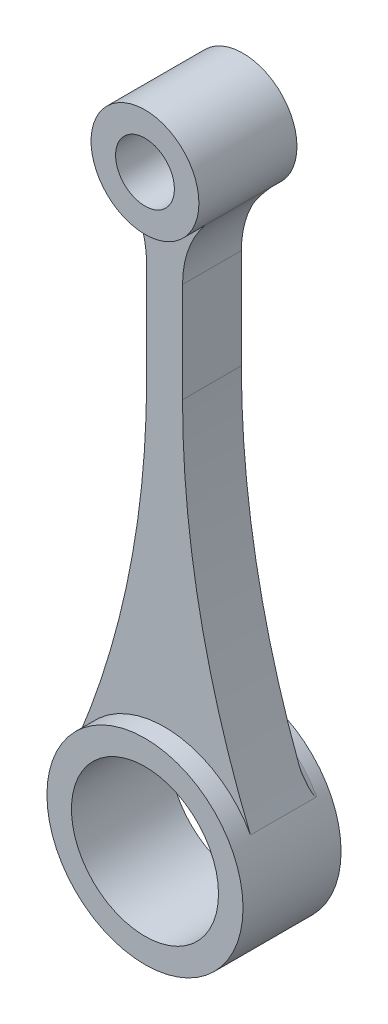
ISO-10303-21;
HEADER;
FILE_DESCRIPTION(('STEP AP214'),'2;1');
FILE_NAME('part.step','',(''),(''),'','','');
FILE_SCHEMA(('AUTOMOTIVE_DESIGN { 1 0 10303 214 1 1 1 1 }'));
ENDSEC;
DATA;
#1=APPLICATION_CONTEXT('core data for automotive mechanical design processes');
#2=APPLICATION_PROTOCOL_DEFINITION('international standard','automotive_design',2000,#1);
#3=PRODUCT_CONTEXT('',#1,'mechanical');
#4=PRODUCT('Part','Part','',(#3));
#5=PRODUCT_RELATED_PRODUCT_CATEGORY('part','',(#4));
#6=PRODUCT_DEFINITION_FORMATION('','',#4);
#7=PRODUCT_DEFINITION_CONTEXT('part definition',#1,'design');
#8=PRODUCT_DEFINITION('design','',#6,#7);
#9=PRODUCT_DEFINITION_SHAPE('','',#8);
#10=(LENGTH_UNIT() NAMED_UNIT(*) SI_UNIT(.MILLI.,.METRE.));
#11=(NAMED_UNIT(*) PLANE_ANGLE_UNIT() SI_UNIT($,.RADIAN.));
#12=(NAMED_UNIT(*) SI_UNIT($,.STERADIAN.) SOLID_ANGLE_UNIT());
#13=UNCERTAINTY_MEASURE_WITH_UNIT(LENGTH_MEASURE(1.E-05),#10,'distance_accuracy_value','');
#14=(GEOMETRIC_REPRESENTATION_CONTEXT(3) GLOBAL_UNCERTAINTY_ASSIGNED_CONTEXT((#13)) GLOBAL_UNIT_ASSIGNED_CONTEXT((#10,
#11,#12)) REPRESENTATION_CONTEXT('',''));
#15=CARTESIAN_POINT('',(0.,0.,0.));
#16=DIRECTION('',(0.,0.,1.));
#17=DIRECTION('',(1.,0.,0.));
#18=AXIS2_PLACEMENT_3D('',#15,#16,#17);
#19=CARTESIAN_POINT('',(0.,107.605051307633,10.));
#20=DIRECTION('',(0.,0.,1.));
#21=DIRECTION('',(1.,0.,0.));
#22=AXIS2_PLACEMENT_3D('',#19,#20,#21);
#23=PLANE('',#22);
#24=CARTESIAN_POINT('',(0.,107.605051307633,10.));
#25=DIRECTION('',(0.,0.,1.));
#26=DIRECTION('',(1.,0.,0.));
#27=AXIS2_PLACEMENT_3D('',#24,#25,#26);
#28=CIRCLE('',#27,11.);
#29=CARTESIAN_POINT('',(11.,107.605051307633,10.));
#30=VERTEX_POINT('',#29);
#31=EDGE_CURVE('E163',#30,#30,#28,.T.);
#32=ORIENTED_EDGE('',*,*,#31,.T.);
#33=EDGE_LOOP('',(#32));
#34=FACE_BOUND('',#33,.T.);
#35=CARTESIAN_POINT('',(0.,107.605051307633,10.));
#36=DIRECTION('',(0.,0.,1.));
#37=DIRECTION('',(1.,0.,0.));
#38=AXIS2_PLACEMENT_3D('',#35,#36,#37);
#39=CIRCLE('',#38,6.);
#40=CARTESIAN_POINT('',(6.,107.605051307633,10.));
#41=VERTEX_POINT('',#40);
#42=EDGE_CURVE('E154',#41,#41,#39,.T.);
#43=ORIENTED_EDGE('',*,*,#42,.F.);
#44=EDGE_LOOP('',(#43));
#45=FACE_BOUND('',#44,.T.);
#46=ADVANCED_FACE('F39',(#34,#45),#23,.T.);
#47=CARTESIAN_POINT('',(0.,107.605051307633,-10.));
#48=DIRECTION('',(0.,0.,1.));
#49=DIRECTION('',(1.,0.,0.));
#50=AXIS2_PLACEMENT_3D('',#47,#48,#49);
#51=PLANE('',#50);
#52=CARTESIAN_POINT('',(0.,107.605051307633,-10.));
#53=DIRECTION('',(0.,0.,1.));
#54=DIRECTION('',(1.,0.,0.));
#55=AXIS2_PLACEMENT_3D('',#52,#53,#54);
#56=CIRCLE('',#55,11.);
#57=CARTESIAN_POINT('',(11.,107.605051307633,-10.));
#58=VERTEX_POINT('',#57);
#59=EDGE_CURVE('E158',#58,#58,#56,.T.);
#60=ORIENTED_EDGE('',*,*,#59,.F.);
#61=EDGE_LOOP('',(#60));
#62=FACE_BOUND('',#61,.T.);
#63=CARTESIAN_POINT('',(0.,107.605051307633,-10.));
#64=DIRECTION('',(0.,0.,1.));
#65=DIRECTION('',(1.,0.,0.));
#66=AXIS2_PLACEMENT_3D('',#63,#64,#65);
#67=CIRCLE('',#66,6.);
#68=CARTESIAN_POINT('',(6.,107.605051307633,-10.));
#69=VERTEX_POINT('',#68);
#70=EDGE_CURVE('E159',#69,#69,#67,.T.);
#71=ORIENTED_EDGE('',*,*,#70,.T.);
#72=EDGE_LOOP('',(#71));
#73=FACE_BOUND('',#72,.T.);
#74=ADVANCED_FACE('F331',(#62,#73),#51,.F.);
#75=CARTESIAN_POINT('',(0.,107.605051307633,10.));
#76=DIRECTION('',(0.,0.,-1.));
#77=DIRECTION('',(-1.,0.,0.));
#78=AXIS2_PLACEMENT_3D('',#75,#76,#77);
#79=CYLINDRICAL_SURFACE('',#78,11.);
#80=DIRECTION('',(0.,0.,-1.));
#81=VECTOR('',#80,1.);
#82=CARTESIAN_POINT('',(8.39624478774809,100.498499860959,10.));
#83=LINE('',#82,#81);
#84=CARTESIAN_POINT('',(8.39624478774809,100.498499860959,6.));
#85=VERTEX_POINT('',#84);
#86=CARTESIAN_POINT('',(8.39624478774809,100.498499860959,-7.5));
#87=VERTEX_POINT('',#86);
#88=EDGE_CURVE('E247',#85,#87,#83,.T.);
#89=ORIENTED_EDGE('',*,*,#88,.T.);
#90=CARTESIAN_POINT('',(0.,107.605051307633,-7.5));
#91=DIRECTION('',(0.,0.,1.));
#92=DIRECTION('',(1.,0.,0.));
#93=AXIS2_PLACEMENT_3D('',#90,#91,#92);
#94=CIRCLE('',#93,11.);
#95=CARTESIAN_POINT('',(-8.39624478774809,100.498499860959,-7.5));
#96=VERTEX_POINT('',#95);
#97=EDGE_CURVE('E176',#87,#96,#94,.F.);
#98=ORIENTED_EDGE('',*,*,#97,.T.);
#99=DIRECTION('',(0.,0.,-1.));
#100=VECTOR('',#99,1.);
#101=CARTESIAN_POINT('',(-8.39624478774809,100.498499860959,10.));
#102=LINE('',#101,#100);
#103=CARTESIAN_POINT('',(-8.39624478774809,100.498499860959,6.));
#104=VERTEX_POINT('',#103);
#105=EDGE_CURVE('E243',#96,#104,#102,.F.);
#106=ORIENTED_EDGE('',*,*,#105,.T.);
#107=CARTESIAN_POINT('',(0.,107.605051307633,6.));
#108=DIRECTION('',(0.,0.,1.));
#109=DIRECTION('',(1.,0.,0.));
#110=AXIS2_PLACEMENT_3D('',#107,#108,#109);
#111=CIRCLE('',#110,11.);
#112=EDGE_CURVE('E295',#104,#85,#111,.T.);
#113=ORIENTED_EDGE('',*,*,#112,.T.);
#114=EDGE_LOOP('',(#89,#98,#106,#113));
#115=FACE_BOUND('',#114,.T.);
#116=ORIENTED_EDGE('',*,*,#31,.F.);
#117=EDGE_LOOP('',(#116));
#118=FACE_BOUND('',#117,.T.);
#119=ORIENTED_EDGE('',*,*,#59,.T.);
#120=EDGE_LOOP('',(#119));
#121=FACE_BOUND('',#120,.T.);
#122=ADVANCED_FACE('F337',(#115,#118,#121),#79,.T.);
#123=CARTESIAN_POINT('',(0.,107.605051307633,10.));
#124=DIRECTION('',(0.,0.,-1.));
#125=DIRECTION('',(-1.,0.,0.));
#126=AXIS2_PLACEMENT_3D('',#123,#124,#125);
#127=CYLINDRICAL_SURFACE('',#126,6.);
#128=ORIENTED_EDGE('',*,*,#42,.T.);
#129=EDGE_LOOP('',(#128));
#130=FACE_BOUND('',#129,.T.);
#131=ORIENTED_EDGE('',*,*,#70,.F.);
#132=EDGE_LOOP('',(#131));
#133=FACE_BOUND('',#132,.T.);
#134=ADVANCED_FACE('F342',(#130,#133),#127,.F.);
#135=CARTESIAN_POINT('',(187.299762397603,67.2325540972158,6.));
#136=DIRECTION('',(0.,0.,-1.));
#137=DIRECTION('',(-1.,0.,0.));
#138=AXIS2_PLACEMENT_3D('',#135,#136,#137);
#139=CYLINDRICAL_SURFACE('',#138,183.637617995767);
#140=CARTESIAN_POINT('',(187.299762397603,67.2325540972158,-6.));
#141=DIRECTION('',(0.,0.,1.));
#142=DIRECTION('',(1.,0.,0.));
#143=AXIS2_PLACEMENT_3D('',#140,#141,#142);
#144=CIRCLE('',#143,183.637617995767);
#145=CARTESIAN_POINT('',(3.66214440183552,67.2325540972158,-6.));
#146=VERTEX_POINT('',#145);
#147=CARTESIAN_POINT('',(15.4145990059245,2.59305109034377,-6.));
#148=VERTEX_POINT('',#147);
#149=EDGE_CURVE('E273',#146,#148,#144,.T.);
#150=ORIENTED_EDGE('',*,*,#149,.F.);
#151=DIRECTION('',(0.,0.,-1.));
#152=VECTOR('',#151,1.);
#153=CARTESIAN_POINT('',(3.66214440183552,67.2325540972158,6.));
#154=LINE('',#153,#152);
#155=CARTESIAN_POINT('',(3.66214440183552,67.2325540972158,6.));
#156=VERTEX_POINT('',#155);
#157=EDGE_CURVE('E148',#156,#146,#154,.T.);
#158=ORIENTED_EDGE('',*,*,#157,.F.);
#159=CARTESIAN_POINT('',(187.299762397603,67.2325540972158,6.));
#160=DIRECTION('',(0.,0.,1.));
#161=DIRECTION('',(1.,0.,0.));
#162=AXIS2_PLACEMENT_3D('',#159,#160,#161);
#163=CIRCLE('',#162,183.637617995767);
#164=CARTESIAN_POINT('',(17.5173390200061,-2.74389519245491,6.));
#165=VERTEX_POINT('',#164);
#166=EDGE_CURVE('E128',#156,#165,#163,.T.);
#167=ORIENTED_EDGE('',*,*,#166,.T.);
#168=DIRECTION('',(0.,0.,-1.));
#169=VECTOR('',#168,1.);
#170=CARTESIAN_POINT('',(17.5173390200062,-2.74389519245523,6.));
#171=LINE('',#170,#169);
#172=CARTESIAN_POINT('',(17.5173390200062,-2.74389519245523,-7.5));
#173=VERTEX_POINT('',#172);
#174=EDGE_CURVE('E122',#165,#173,#171,.T.);
#175=ORIENTED_EDGE('',*,*,#174,.T.);
#176=CARTESIAN_POINT('',(17.5173390200062,-2.74389519245523,-7.5));
#177=CARTESIAN_POINT('',(17.51735573851,-2.74393567324931,-7.48851173677404));
#178=CARTESIAN_POINT('',(17.5168922673135,-2.74281125223775,-7.47709242558947));
#179=CARTESIAN_POINT('',(17.5151720796808,-2.7386374145088,-7.45487181468735));
#180=CARTESIAN_POINT('',(17.5139294624975,-2.73562221284344,-7.44406317666302));
#181=CARTESIAN_POINT('',(17.5103231654911,-2.72687053611399,-7.41986807107477));
#182=CARTESIAN_POINT('',(17.5077311696782,-2.72057973623293,-7.40672357144071));
#183=CARTESIAN_POINT('',(17.5017970390369,-2.70617455989132,-7.38157370540726));
#184=CARTESIAN_POINT('',(17.4984491956093,-2.69804630528259,-7.36957805277809));
#185=CARTESIAN_POINT('',(17.4860406254159,-2.66791201973124,-7.32986082728316));
#186=CARTESIAN_POINT('',(17.47578440042,-2.64299257502629,-7.30479231123242));
#187=CARTESIAN_POINT('',(17.4541321808257,-2.5903467119074,-7.25845329225627));
#188=CARTESIAN_POINT('',(17.4427299893404,-2.56260502093156,-7.23720538600421));
#189=CARTESIAN_POINT('',(17.4191706446907,-2.50524239743892,-7.19690165621906));
#190=CARTESIAN_POINT('',(17.4070053247135,-2.47560101739644,-7.17787962663902));
#191=CARTESIAN_POINT('',(17.3823196729313,-2.41540685843484,-7.14157302129721));
#192=CARTESIAN_POINT('',(17.3697990522024,-2.38485333666376,-7.12428991470573));
#193=CARTESIAN_POINT('',(17.3318528930498,-2.29218202308343,-7.07424291158188));
#194=CARTESIAN_POINT('',(17.306097079078,-2.22918498579741,-7.04336623782041));
#195=CARTESIAN_POINT('',(17.254120363003,-2.10184663478345,-6.98458548815966));
#196=CARTESIAN_POINT('',(17.2278985027794,-2.03750248735429,-6.95668863556345));
#197=CARTESIAN_POINT('',(17.1752571060932,-1.90811637751019,-6.90309425130207));
#198=CARTESIAN_POINT('',(17.1488379243914,-1.84307560416529,-6.87739348918797));
#199=CARTESIAN_POINT('',(17.0696437505711,-1.64778494408082,-6.80296265492123));
#200=CARTESIAN_POINT('',(17.0166650996588,-1.51671262620864,-6.75661768067588));
#201=CARTESIAN_POINT('',(16.9104898337022,-1.25314332976965,-6.66840104376475));
#202=CARTESIAN_POINT('',(16.8572931693504,-1.12064601649717,-6.62653045847536));
#203=CARTESIAN_POINT('',(16.7507430237872,-0.854355997240389,-6.54654338945691));
#204=CARTESIAN_POINT('',(16.697389427371,-0.720561745558572,-6.50843220941936));
#205=CARTESIAN_POINT('',(16.5906738516995,-0.452028397739109,-6.43579290078771));
#206=CARTESIAN_POINT('',(16.5373118740231,-0.317289407703597,-6.40126437650008));
#207=CARTESIAN_POINT('',(16.4308087346311,-0.0474308724189624,-6.33592383021254));
#208=CARTESIAN_POINT('',(16.3776674898167,0.0876853934391024,-6.30509846276099));
#209=CARTESIAN_POINT('',(16.2714354998632,0.35873753784847,-6.2471944241098));
#210=CARTESIAN_POINT('',(16.2183447576052,0.494673460253134,-6.22011595526702));
#211=CARTESIAN_POINT('',(16.0592769822816,0.90340304984519,-6.14494542546896));
#212=CARTESIAN_POINT('',(15.9533923330873,1.17740243673041,-6.10284852201819));
#213=CARTESIAN_POINT('',(15.8115435660535,1.54712340565829,-6.05946315143186));
#214=CARTESIAN_POINT('',(15.7753194669296,1.64177336188693,-6.04952893086151));
#215=CARTESIAN_POINT('',(15.7029489083265,1.83134131602275,-6.0321805326155));
#216=CARTESIAN_POINT('',(15.6668024508486,1.92625932069693,-6.02476641914507));
#217=CARTESIAN_POINT('',(15.5945723765559,2.11640544725831,-6.01267298083491));
#218=CARTESIAN_POINT('',(15.5584888593748,2.2116337849174,-6.00799641133948));
#219=CARTESIAN_POINT('',(15.4864444805109,2.40224544880233,-6.00166375381254));
#220=CARTESIAN_POINT('',(15.4504836300477,2.49762878808667,-6.00000793505322));
#221=CARTESIAN_POINT('',(15.4145990059245,2.59305109034377,-6.));
#222=B_SPLINE_CURVE_WITH_KNOTS('',3,(#176,#177,#178,#179,#180,#181,#182,#183,#184,#185,#186,
#187,#188,#189,#190,#191,#192,#193,#194,#195,#196,#197,#198,#199,#200,#201,#202,#203,#204,#205,
#206,#207,#208,#209,#210,#211,#212,#213,#214,#215,#216,#217,#218,#219,#220,#221),.UNSPECIFIED.,
.F.,.F.,(4,2,2,2,2,2,2,2,2,2,2,2,2,2,2,2,2,2,2,2,2,2,4),(0.,0.0342904396752475,
0.0679775975404473,0.112127228937768,0.156622173838151,0.266178652755772,0.376363184908681,
0.488048279530886,0.599826955270256,0.82387959386339,1.048463583091,1.2727113082466,
1.71892239917628,2.16524069115383,2.61217989508811,3.05906968327119,3.50429731494634,
3.949548982429,4.83911408571895,5.14458465938705,5.45006301500208,5.75584830896027,
6.06166085953665),.UNSPECIFIED.);
#223=EDGE_CURVE('E190',#173,#148,#222,.T.);
#224=ORIENTED_EDGE('',*,*,#223,.T.);
#225=EDGE_LOOP('',(#150,#158,#167,#175,#224));
#226=FACE_BOUND('',#225,.T.);
#227=ADVANCED_FACE('F283',(#226),#139,.F.);
#228=CARTESIAN_POINT('',(3.66214440183552,97.2325540972158,6.));
#229=DIRECTION('',(1.,0.,0.));
#230=DIRECTION('',(0.,0.,-1.));
#231=AXIS2_PLACEMENT_3D('',#228,#229,#230);
#232=PLANE('',#231);
#233=DIRECTION('',(0.,-1.,0.));
#234=VECTOR('',#233,1.);
#235=CARTESIAN_POINT('',(3.66214440183552,97.2325540972158,-6.));
#236=LINE('',#235,#234);
#237=CARTESIAN_POINT('',(3.66214440183552,87.5774972306445,-6.));
#238=VERTEX_POINT('',#237);
#239=EDGE_CURVE('E268',#238,#146,#236,.T.);
#240=ORIENTED_EDGE('',*,*,#239,.F.);
#241=DIRECTION('',(0.,0.,-1.));
#242=VECTOR('',#241,1.);
#243=CARTESIAN_POINT('',(3.66214440183552,87.5774972306445,6.));
#244=LINE('',#243,#242);
#245=CARTESIAN_POINT('',(3.66214440183552,87.5774972306445,6.));
#246=VERTEX_POINT('',#245);
#247=EDGE_CURVE('E251',#238,#246,#244,.F.);
#248=ORIENTED_EDGE('',*,*,#247,.T.);
#249=DIRECTION('',(0.,-1.,0.));
#250=VECTOR('',#249,1.);
#251=CARTESIAN_POINT('',(3.66214440183552,97.2325540972158,6.));
#252=LINE('',#251,#250);
#253=EDGE_CURVE('E150',#246,#156,#252,.T.);
#254=ORIENTED_EDGE('',*,*,#253,.T.);
#255=ORIENTED_EDGE('',*,*,#157,.T.);
#256=EDGE_LOOP('',(#240,#248,#254,#255));
#257=FACE_BOUND('',#256,.T.);
#258=ADVANCED_FACE('F280',(#257),#232,.T.);
#259=CARTESIAN_POINT('',(-3.66214440183552,97.2325540972158,6.));
#260=DIRECTION('',(1.,0.,0.));
#261=DIRECTION('',(0.,1.,0.));
#262=AXIS2_PLACEMENT_3D('',#259,#260,#261);
#263=PLANE('',#262);
#264=DIRECTION('',(0.,-1.,0.));
#265=VECTOR('',#264,1.);
#266=CARTESIAN_POINT('',(-3.66214440183552,97.2325540972158,6.));
#267=LINE('',#266,#265);
#268=CARTESIAN_POINT('',(-3.66214440183552,87.5774972306445,6.));
#269=VERTEX_POINT('',#268);
#270=CARTESIAN_POINT('',(-3.66214440183552,67.2325540972158,6.));
#271=VERTEX_POINT('',#270);
#272=EDGE_CURVE('E133',#269,#271,#267,.T.);
#273=ORIENTED_EDGE('',*,*,#272,.F.);
#274=DIRECTION('',(0.,0.,1.));
#275=VECTOR('',#274,1.);
#276=CARTESIAN_POINT('',(-3.66214440183552,87.5774972306445,-7.5));
#277=LINE('',#276,#275);
#278=CARTESIAN_POINT('',(-3.66214440183552,87.5774972306445,-6.));
#279=VERTEX_POINT('',#278);
#280=EDGE_CURVE('E222',#269,#279,#277,.F.);
#281=ORIENTED_EDGE('',*,*,#280,.T.);
#282=DIRECTION('',(0.,-1.,0.));
#283=VECTOR('',#282,1.);
#284=CARTESIAN_POINT('',(-3.66214440183552,97.2325540972158,-6.));
#285=LINE('',#284,#283);
#286=CARTESIAN_POINT('',(-3.66214440183552,67.2325540972158,-6.));
#287=VERTEX_POINT('',#286);
#288=EDGE_CURVE('E263',#279,#287,#285,.T.);
#289=ORIENTED_EDGE('',*,*,#288,.T.);
#290=DIRECTION('',(0.,0.,-1.));
#291=VECTOR('',#290,1.);
#292=CARTESIAN_POINT('',(-3.66214440183552,67.2325540972158,6.));
#293=LINE('',#292,#291);
#294=EDGE_CURVE('E144',#271,#287,#293,.T.);
#295=ORIENTED_EDGE('',*,*,#294,.F.);
#296=EDGE_LOOP('',(#273,#281,#289,#295));
#297=FACE_BOUND('',#296,.T.);
#298=ADVANCED_FACE('F262',(#297),#263,.F.);
#299=CARTESIAN_POINT('',(-187.299762397603,67.2325540972158,6.));
#300=DIRECTION('',(0.,0.,-1.));
#301=DIRECTION('',(-1.,0.,0.));
#302=AXIS2_PLACEMENT_3D('',#299,#300,#301);
#303=CYLINDRICAL_SURFACE('',#302,183.637617995767);
#304=CARTESIAN_POINT('',(-187.299762397603,67.2325540972158,-6.));
#305=DIRECTION('',(0.,0.,-1.));
#306=DIRECTION('',(-1.,0.,0.));
#307=AXIS2_PLACEMENT_3D('',#304,#305,#306);
#308=CIRCLE('',#307,183.637617995767);
#309=CARTESIAN_POINT('',(-15.4145990059246,2.59305109034372,-6.));
#310=VERTEX_POINT('',#309);
#311=EDGE_CURVE('E266',#287,#310,#308,.T.);
#312=ORIENTED_EDGE('',*,*,#311,.T.);
#313=CARTESIAN_POINT('',(-15.4145990059246,2.59305109034373,-6.));
#314=CARTESIAN_POINT('',(-15.4591253437415,2.4746489978609,-6.00001833175739));
#315=CARTESIAN_POINT('',(-15.50376706422,2.35631249311233,-6.00256134405457));
#316=CARTESIAN_POINT('',(-15.5932217388589,2.11992410214308,-6.01219604839708));
#317=CARTESIAN_POINT('',(-15.638034642008,2.00187214599045,-6.01928647667919));
#318=CARTESIAN_POINT('',(-15.7277566347009,1.76624623003284,-6.03750771141809));
#319=CARTESIAN_POINT('',(-15.7726656017225,1.64867193617019,-6.04863488367621));
#320=CARTESIAN_POINT('',(-15.862591510661,1.41396266882228,-6.0745442344239));
#321=CARTESIAN_POINT('',(-15.9076084608016,1.29682773065906,-6.08932670064751));
#322=CARTESIAN_POINT('',(-16.0425666513777,0.946732815053856,-6.13856883730555));
#323=CARTESIAN_POINT('',(-16.1326339858892,0.714508326404417,-6.17797107842304));
#324=CARTESIAN_POINT('',(-16.3129653728524,0.252321672916581,-6.26801308009756));
#325=CARTESIAN_POINT('',(-16.4032294511411,0.0223598301938992,-6.31865441718095));
#326=CARTESIAN_POINT('',(-16.5526557495034,-0.356100631313044,-6.4109385176592));
#327=CARTESIAN_POINT('',(-16.6118018657047,-0.505326507251443,-6.44965607139205));
#328=CARTESIAN_POINT('',(-16.7300707707244,-0.802588449884724,-6.53150441312011));
#329=CARTESIAN_POINT('',(-16.7891935584378,-0.950624465453962,-6.57463538966846));
#330=CARTESIAN_POINT('',(-16.88830057662,-1.19784860763889,-6.65109448473149));
#331=CARTESIAN_POINT('',(-16.9283220445262,-1.29742834852461,-6.68311160180542));
#332=CARTESIAN_POINT('',(-17.0082399899693,-1.49577750662345,-6.74973803088693));
#333=CARTESIAN_POINT('',(-17.0481364659257,-1.59454691361452,-6.78434737553886));
#334=CARTESIAN_POINT('',(-17.1147186363118,-1.75897240613626,-6.84507351352165));
#335=CARTESIAN_POINT('',(-17.1414741101837,-1.82493419876159,-6.87028414699466));
#336=CARTESIAN_POINT('',(-17.1947909483557,-1.95616206109321,-6.92263303998303));
#337=CARTESIAN_POINT('',(-17.2213523398443,-2.0214282288589,-6.94977102356139));
#338=CARTESIAN_POINT('',(-17.2655754286164,-2.1299158234263,-6.99747366431647));
#339=CARTESIAN_POINT('',(-17.283327122294,-2.17341570797048,-7.01731236174853));
#340=CARTESIAN_POINT('',(-17.3185710591651,-2.25968655995933,-7.05861372460116));
#341=CARTESIAN_POINT('',(-17.3360634885055,-2.3024580540261,-7.08007514990952));
#342=CARTESIAN_POINT('',(-17.3769524803932,-2.40233114904229,-7.13340509111458));
#343=CARTESIAN_POINT('',(-17.4001972415683,-2.45902312743475,-7.16623099475992));
#344=CARTESIAN_POINT('',(-17.4339414736515,-2.54121275123609,-7.22170674279113));
#345=CARTESIAN_POINT('',(-17.4451037658347,-2.56838071018896,-7.24145849945057));
#346=CARTESIAN_POINT('',(-17.4665462690267,-2.62053614866084,-7.28409595350626));
#347=CARTESIAN_POINT('',(-17.4768296324166,-2.64553142675746,-7.30696961450763));
#348=CARTESIAN_POINT('',(-17.4898831608726,-2.67724320117085,-7.3426502852329));
#349=CARTESIAN_POINT('',(-17.4934784839717,-2.68597538852625,-7.35333231677882));
#350=CARTESIAN_POINT('',(-17.5001850460838,-2.7022609140383,-7.37572687094968));
#351=CARTESIAN_POINT('',(-17.5032963515591,-2.70981441404495,-7.38743925174749));
#352=CARTESIAN_POINT('',(-17.5082943038982,-2.72194640887259,-7.4097695880997));
#353=CARTESIAN_POINT('',(-17.5103007644943,-2.72681611517289,-7.42019928947174));
#354=CARTESIAN_POINT('',(-17.5136417019522,-2.73492393165498,-7.44176066853348));
#355=CARTESIAN_POINT('',(-17.5149788063757,-2.73816842166544,-7.45288940526912));
#356=CARTESIAN_POINT('',(-17.5163686695922,-2.74154081588352,-7.4701092144821));
#357=CARTESIAN_POINT('',(-17.5167298302147,-2.74241711428268,-7.47603351857085));
#358=CARTESIAN_POINT('',(-17.5172161510177,-2.74359707825882,-7.48796994760819));
#359=CARTESIAN_POINT('',(-17.5173404421802,-2.74389863524604,-7.49398231469944));
#360=CARTESIAN_POINT('',(-17.5173390200061,-2.74389519245501,-7.50000000000005));
#361=B_SPLINE_CURVE_WITH_KNOTS('',3,(#313,#314,#315,#316,#317,#318,#319,#320,#321,#322,#323,
#324,#325,#326,#327,#328,#329,#330,#331,#332,#333,#334,#335,#336,#337,#338,#339,#340,#341,#342,
#343,#344,#345,#346,#347,#348,#349,#350,#351,#352,#353,#354,#355,#356,#357,#358,#359,#360),
.UNSPECIFIED.,.F.,.F.,(4,2,2,2,2,2,2,2,2,2,2,2,2,2,2,2,2,2,2,2,2,2,2,4),(0.,0.379437792770444,
0.758770182412722,1.13776191085498,1.5167834819197,2.27297961993758,3.02928189794061,
3.5245977364563,4.01993474501966,4.35589651282456,4.69186251216161,4.91838507987858,
5.14487528168375,5.29784136050166,5.45069169949716,5.65880186742585,5.76491102134331,
5.87062206038171,5.91333170520755,5.95603548024064,5.99097419785725,6.02577466621551,
6.04374370328876,6.06177853853792),.UNSPECIFIED.);
#362=CARTESIAN_POINT('',(-17.5173390200062,-2.74389519245523,-7.5));
#363=VERTEX_POINT('',#362);
#364=EDGE_CURVE('E141',#310,#363,#361,.T.);
#365=ORIENTED_EDGE('',*,*,#364,.T.);
#366=DIRECTION('',(0.,0.,-1.));
#367=VECTOR('',#366,1.);
#368=CARTESIAN_POINT('',(-17.5173390200062,-2.74389519245523,6.));
#369=LINE('',#368,#367);
#370=CARTESIAN_POINT('',(-17.517339020006,-2.74389519245488,6.));
#371=VERTEX_POINT('',#370);
#372=EDGE_CURVE('E120',#371,#363,#369,.T.);
#373=ORIENTED_EDGE('',*,*,#372,.F.);
#374=CARTESIAN_POINT('',(-187.299762397603,67.2325540972158,6.));
#375=DIRECTION('',(0.,0.,-1.));
#376=DIRECTION('',(-1.,0.,0.));
#377=AXIS2_PLACEMENT_3D('',#374,#375,#376);
#378=CIRCLE('',#377,183.637617995767);
#379=EDGE_CURVE('E127',#271,#371,#378,.T.);
#380=ORIENTED_EDGE('',*,*,#379,.F.);
#381=ORIENTED_EDGE('',*,*,#294,.T.);
#382=EDGE_LOOP('',(#312,#365,#373,#380,#381));
#383=FACE_BOUND('',#382,.T.);
#384=ADVANCED_FACE('F140',(#383),#303,.F.);
#385=CARTESIAN_POINT('',(187.299762397603,67.2325540972158,6.));
#386=DIRECTION('',(0.,0.,1.));
#387=DIRECTION('',(1.,0.,0.));
#388=AXIS2_PLACEMENT_3D('',#385,#386,#387);
#389=PLANE('',#388);
#390=ORIENTED_EDGE('',*,*,#166,.F.);
#391=ORIENTED_EDGE('',*,*,#253,.F.);
#392=CARTESIAN_POINT('',(23.6621444018355,87.5774972306445,6.));
#393=DIRECTION('',(0.,0.,1.));
#394=DIRECTION('',(1.,0.,0.));
#395=AXIS2_PLACEMENT_3D('',#392,#393,#394);
#396=CIRCLE('',#395,20.);
#397=EDGE_CURVE('E226',#246,#85,#396,.F.);
#398=ORIENTED_EDGE('',*,*,#397,.T.);
#399=ORIENTED_EDGE('',*,*,#112,.F.);
#400=CARTESIAN_POINT('',(-23.6621444018355,87.5774972306445,6.));
#401=DIRECTION('',(0.,0.,1.));
#402=DIRECTION('',(1.,0.,0.));
#403=AXIS2_PLACEMENT_3D('',#400,#401,#402);
#404=CIRCLE('',#403,20.);
#405=EDGE_CURVE('E11',#104,#269,#404,.F.);
#406=ORIENTED_EDGE('',*,*,#405,.T.);
#407=ORIENTED_EDGE('',*,*,#272,.T.);
#408=ORIENTED_EDGE('',*,*,#379,.T.);
#409=CARTESIAN_POINT('',(0.,-12.3949486923674,6.));
#410=DIRECTION('',(0.,0.,1.));
#411=DIRECTION('',(1.,0.,0.));
#412=AXIS2_PLACEMENT_3D('',#409,#410,#411);
#413=CIRCLE('',#412,20.);
#414=EDGE_CURVE('E114',#165,#371,#413,.T.);
#415=ORIENTED_EDGE('',*,*,#414,.F.);
#416=EDGE_LOOP('',(#390,#391,#398,#399,#406,#407,#408,#415));
#417=FACE_BOUND('',#416,.T.);
#418=ADVANCED_FACE('F131',(#417),#389,.T.);
#419=CARTESIAN_POINT('',(187.299762397603,67.2325540972158,-6.));
#420=DIRECTION('',(0.,0.,1.));
#421=DIRECTION('',(1.,0.,0.));
#422=AXIS2_PLACEMENT_3D('',#419,#420,#421);
#423=PLANE('',#422);
#424=ORIENTED_EDGE('',*,*,#288,.F.);
#425=CARTESIAN_POINT('',(-23.6621444018355,87.5774972306445,-6.));
#426=DIRECTION('',(0.,0.,1.));
#427=DIRECTION('',(1.,0.,0.));
#428=AXIS2_PLACEMENT_3D('',#425,#426,#427);
#429=CIRCLE('',#428,20.);
#430=CARTESIAN_POINT('',(-5.77127238751393,96.5171112361351,-6.));
#431=VERTEX_POINT('',#430);
#432=EDGE_CURVE('E230',#279,#431,#429,.T.);
#433=ORIENTED_EDGE('',*,*,#432,.T.);
#434=CARTESIAN_POINT('',(0.,107.605051307633,-6.));
#435=DIRECTION('',(0.,0.,1.));
#436=DIRECTION('',(1.,0.,0.));
#437=AXIS2_PLACEMENT_3D('',#434,#435,#436);
#438=CIRCLE('',#437,12.5);
#439=CARTESIAN_POINT('',(5.77127238751395,96.5171112361351,-6.));
#440=VERTEX_POINT('',#439);
#441=EDGE_CURVE('E56',#431,#440,#438,.T.);
#442=ORIENTED_EDGE('',*,*,#441,.T.);
#443=CARTESIAN_POINT('',(23.6621444018355,87.5774972306445,-6.));
#444=DIRECTION('',(0.,0.,1.));
#445=DIRECTION('',(1.,0.,0.));
#446=AXIS2_PLACEMENT_3D('',#443,#444,#445);
#447=CIRCLE('',#446,20.);
#448=EDGE_CURVE('E221',#440,#238,#447,.T.);
#449=ORIENTED_EDGE('',*,*,#448,.T.);
#450=ORIENTED_EDGE('',*,*,#239,.T.);
#451=ORIENTED_EDGE('',*,*,#149,.T.);
#452=CARTESIAN_POINT('',(0.,-12.3949486923674,-6.));
#453=DIRECTION('',(0.,0.,1.));
#454=DIRECTION('',(1.,0.,0.));
#455=AXIS2_PLACEMENT_3D('',#452,#453,#454);
#456=CIRCLE('',#455,21.5);
#457=EDGE_CURVE('E167',#148,#310,#456,.T.);
#458=ORIENTED_EDGE('',*,*,#457,.T.);
#459=ORIENTED_EDGE('',*,*,#311,.F.);
#460=EDGE_LOOP('',(#424,#433,#442,#449,#450,#451,#458,#459));
#461=FACE_BOUND('',#460,.T.);
#462=ADVANCED_FACE('F265',(#461),#423,.F.);
#463=CARTESIAN_POINT('',(0.,-12.3949486923674,10.));
#464=DIRECTION('',(0.,0.,1.));
#465=DIRECTION('',(1.,0.,0.));
#466=AXIS2_PLACEMENT_3D('',#463,#464,#465);
#467=PLANE('',#466);
#468=CARTESIAN_POINT('',(0.,-12.3949486923674,10.));
#469=DIRECTION('',(0.,0.,1.));
#470=DIRECTION('',(1.,0.,0.));
#471=AXIS2_PLACEMENT_3D('',#468,#469,#470);
#472=CIRCLE('',#471,20.);
#473=CARTESIAN_POINT('',(20.,-12.3949486923674,10.));
#474=VERTEX_POINT('',#473);
#475=EDGE_CURVE('E287',#474,#474,#472,.T.);
#476=ORIENTED_EDGE('',*,*,#475,.T.);
#477=EDGE_LOOP('',(#476));
#478=FACE_BOUND('',#477,.T.);
#479=CARTESIAN_POINT('',(0.,-12.3949486923674,10.));
#480=DIRECTION('',(0.,0.,1.));
#481=DIRECTION('',(1.,0.,0.));
#482=AXIS2_PLACEMENT_3D('',#479,#480,#481);
#483=CIRCLE('',#482,15.);
#484=CARTESIAN_POINT('',(15.,-12.3949486923674,10.));
#485=VERTEX_POINT('',#484);
#486=EDGE_CURVE('E304',#485,#485,#483,.T.);
#487=ORIENTED_EDGE('',*,*,#486,.F.);
#488=EDGE_LOOP('',(#487));
#489=FACE_BOUND('',#488,.T.);
#490=ADVANCED_FACE('F317',(#478,#489),#467,.T.);
#491=CARTESIAN_POINT('',(0.,-12.3949486923674,-10.));
#492=DIRECTION('',(0.,0.,1.));
#493=DIRECTION('',(1.,0.,0.));
#494=AXIS2_PLACEMENT_3D('',#491,#492,#493);
#495=PLANE('',#494);
#496=CARTESIAN_POINT('',(0.,-12.3949486923674,-10.));
#497=DIRECTION('',(0.,0.,1.));
#498=DIRECTION('',(1.,0.,0.));
#499=AXIS2_PLACEMENT_3D('',#496,#497,#498);
#500=CIRCLE('',#499,20.);
#501=CARTESIAN_POINT('',(20.,-12.3949486923674,-10.));
#502=VERTEX_POINT('',#501);
#503=EDGE_CURVE('E290',#502,#502,#500,.T.);
#504=ORIENTED_EDGE('',*,*,#503,.F.);
#505=EDGE_LOOP('',(#504));
#506=FACE_BOUND('',#505,.T.);
#507=CARTESIAN_POINT('',(0.,-12.3949486923674,-10.));
#508=DIRECTION('',(0.,0.,1.));
#509=DIRECTION('',(1.,0.,0.));
#510=AXIS2_PLACEMENT_3D('',#507,#508,#509);
#511=CIRCLE('',#510,15.);
#512=CARTESIAN_POINT('',(15.,-12.3949486923674,-10.));
#513=VERTEX_POINT('',#512);
#514=EDGE_CURVE('E306',#513,#513,#511,.T.);
#515=ORIENTED_EDGE('',*,*,#514,.T.);
#516=EDGE_LOOP('',(#515));
#517=FACE_BOUND('',#516,.T.);
#518=ADVANCED_FACE('F319',(#506,#517),#495,.F.);
#519=CARTESIAN_POINT('',(0.,-12.3949486923674,10.));
#520=DIRECTION('',(0.,0.,-1.));
#521=DIRECTION('',(-1.,0.,0.));
#522=AXIS2_PLACEMENT_3D('',#519,#520,#521);
#523=CYLINDRICAL_SURFACE('',#522,20.);
#524=ORIENTED_EDGE('',*,*,#372,.T.);
#525=CARTESIAN_POINT('',(0.,-12.3949486923674,-7.5));
#526=DIRECTION('',(0.,0.,1.));
#527=DIRECTION('',(1.,0.,0.));
#528=AXIS2_PLACEMENT_3D('',#525,#526,#527);
#529=CIRCLE('',#528,20.);
#530=EDGE_CURVE('E179',#363,#173,#529,.F.);
#531=ORIENTED_EDGE('',*,*,#530,.T.);
#532=ORIENTED_EDGE('',*,*,#174,.F.);
#533=ORIENTED_EDGE('',*,*,#414,.T.);
#534=EDGE_LOOP('',(#524,#531,#532,#533));
#535=FACE_BOUND('',#534,.T.);
#536=ORIENTED_EDGE('',*,*,#475,.F.);
#537=EDGE_LOOP('',(#536));
#538=FACE_BOUND('',#537,.T.);
#539=ORIENTED_EDGE('',*,*,#503,.T.);
#540=EDGE_LOOP('',(#539));
#541=FACE_BOUND('',#540,.T.);
#542=ADVANCED_FACE('F116',(#535,#538,#541),#523,.T.);
#543=CARTESIAN_POINT('',(0.,-12.3949486923674,10.));
#544=DIRECTION('',(0.,0.,-1.));
#545=DIRECTION('',(-1.,0.,0.));
#546=AXIS2_PLACEMENT_3D('',#543,#544,#545);
#547=CYLINDRICAL_SURFACE('',#546,15.);
#548=ORIENTED_EDGE('',*,*,#486,.T.);
#549=EDGE_LOOP('',(#548));
#550=FACE_BOUND('',#549,.T.);
#551=ORIENTED_EDGE('',*,*,#514,.F.);
#552=EDGE_LOOP('',(#551));
#553=FACE_BOUND('',#552,.T.);
#554=ADVANCED_FACE('F314',(#550,#553),#547,.F.);
#555=CARTESIAN_POINT('',(0.,107.605051307633,-7.5));
#556=DIRECTION('',(0.,0.,1.));
#557=DIRECTION('',(1.,0.,0.));
#558=AXIS2_PLACEMENT_3D('',#555,#556,#557);
#559=TOROIDAL_SURFACE('',#558,12.5,1.5);
#560=ORIENTED_EDGE('',*,*,#441,.F.);
#561=CARTESIAN_POINT('',(-5.77127238751393,96.5171112361351,-6.));
#562=CARTESIAN_POINT('',(-5.80788546831032,96.590387535224,-6.00000925177807));
#563=CARTESIAN_POINT('',(-5.84493560425475,96.6634075825201,-6.0023116451661));
#564=CARTESIAN_POINT('',(-5.91980576618623,96.8087533178683,-6.0110334779326));
#565=CARTESIAN_POINT('',(-5.95762531940118,96.8810793943853,-6.0174504589038));
#566=CARTESIAN_POINT('',(-6.07191492444177,97.0964351879347,-6.04212441147723));
#567=CARTESIAN_POINT('',(-6.149440676538,97.2382919270754,-6.06581023051452));
#568=CARTESIAN_POINT('',(-6.30595220926697,97.516705078857,-6.12436470006716));
#569=CARTESIAN_POINT('',(-6.38491377665228,97.6533017552425,-6.15911205278896));
#570=CARTESIAN_POINT('',(-6.54490732775526,97.9227747463751,-6.23760984310502));
#571=CARTESIAN_POINT('',(-6.62594109204838,98.0556476408773,-6.28136826800807));
#572=CARTESIAN_POINT('',(-6.83791133008582,98.3943948250155,-6.40371242923492));
#573=CARTESIAN_POINT('',(-6.97026685817547,98.5974249358863,-6.48768150142458));
#574=CARTESIAN_POINT('',(-7.23954914589873,98.9948530333065,-6.66761005920629));
#575=CARTESIAN_POINT('',(-7.376476654892,99.1892495925068,-6.76357151752164));
#576=CARTESIAN_POINT('',(-7.65565561869802,99.5711812608097,-6.9632781453497));
#577=CARTESIAN_POINT('',(-7.79792338587577,99.758691176839,-7.06704833575664));
#578=CARTESIAN_POINT('',(-8.08788200844886,100.127291152339,-7.2781908260671));
#579=CARTESIAN_POINT('',(-8.23557178948216,100.308382469815,-7.38556241200045));
#580=CARTESIAN_POINT('',(-8.38965305681048,100.490708836788,-7.49530812204724));
#581=CARTESIAN_POINT('',(-8.39294818132313,100.494604981248,-7.49765406358575));
#582=CARTESIAN_POINT('',(-8.39624478774808,100.498499860959,-7.5));
#583=B_SPLINE_CURVE_WITH_KNOTS('',3,(#561,#562,#563,#564,#565,#566,#567,#568,#569,#570,#571,
#572,#573,#574,#575,#576,#577,#578,#579,#580,#581,#582),.UNSPECIFIED.,.F.,.F.,(4,2,2,2,2,2,2,2,
2,2,4),(0.,0.245656008911965,0.491165378465973,0.980682937116639,1.46500748572378,
1.9497631962069,2.71855630954783,3.48747605468064,4.25897409193326,5.030320074741,
5.04716854660825),.UNSPECIFIED.);
#584=EDGE_CURVE('E49',#431,#96,#583,.T.);
#585=ORIENTED_EDGE('',*,*,#584,.T.);
#586=ORIENTED_EDGE('',*,*,#97,.F.);
#587=CARTESIAN_POINT('',(5.77127238751394,96.5171112361351,-6.));
#588=CARTESIAN_POINT('',(5.8078854683103,96.590387535224,-6.00000925177808));
#589=CARTESIAN_POINT('',(5.84493560425469,96.6634075825199,-6.0023116451661));
#590=CARTESIAN_POINT('',(5.91980576618609,96.808753317868,-6.01103347793258));
#591=CARTESIAN_POINT('',(5.95762531940101,96.8810793943849,-6.01745045890377));
#592=CARTESIAN_POINT('',(6.07191492444149,97.0964351879341,-6.04212441147716));
#593=CARTESIAN_POINT('',(6.14944067653765,97.2382919270748,-6.0658102305144));
#594=CARTESIAN_POINT('',(6.30595220926663,97.5167050788564,-6.12436470006701));
#595=CARTESIAN_POINT('',(6.38491377665201,97.653301755242,-6.15911205278883));
#596=CARTESIAN_POINT('',(6.54490732775514,97.9227747463749,-6.23760984310494));
#597=CARTESIAN_POINT('',(6.62594109204833,98.0556476408772,-6.28136826800803));
#598=CARTESIAN_POINT('',(6.83791133008584,98.3943948250155,-6.40371242923494));
#599=CARTESIAN_POINT('',(6.97026685817549,98.5974249358863,-6.48768150142467));
#600=CARTESIAN_POINT('',(7.23954914589885,98.9948530333066,-6.66761005920627));
#601=CARTESIAN_POINT('',(7.37647665489221,99.1892495925071,-6.76357151752146));
#602=CARTESIAN_POINT('',(7.65565561869808,99.5711812608098,-6.96327814535005));
#603=CARTESIAN_POINT('',(7.79792338587559,99.7586911768389,-7.06704833575768));
#604=CARTESIAN_POINT('',(8.08788200844923,100.12729115234,-7.27819082606616));
#605=CARTESIAN_POINT('',(8.23557178948333,100.308382469816,-7.38556241199684));
#606=CARTESIAN_POINT('',(8.38965305681052,100.490708836788,-7.49530812204708));
#607=CARTESIAN_POINT('',(8.39294818132315,100.494604981248,-7.49765406358567));
#608=CARTESIAN_POINT('',(8.39624478774808,100.498499860959,-7.5));
#609=B_SPLINE_CURVE_WITH_KNOTS('',3,(#587,#588,#589,#590,#591,#592,#593,#594,#595,#596,#597,
#598,#599,#600,#601,#602,#603,#604,#605,#606,#607,#608),.UNSPECIFIED.,.F.,.F.,(4,2,2,2,2,2,2,2,
2,2,4),(0.,0.245656008911716,0.491165378465485,0.980682937115763,1.46500748572337,
1.9497631962069,2.71855630954792,3.48747605468091,4.25897409193342,5.03032007474097,
5.04716854660824),.UNSPECIFIED.);
#610=EDGE_CURVE('E213',#87,#440,#609,.F.);
#611=ORIENTED_EDGE('',*,*,#610,.T.);
#612=EDGE_LOOP('',(#560,#585,#586,#611));
#613=FACE_BOUND('',#612,.T.);
#614=ADVANCED_FACE('F204',(#613),#559,.F.);
#615=CARTESIAN_POINT('',(0.,-12.3949486923674,-7.5));
#616=DIRECTION('',(0.,0.,1.));
#617=DIRECTION('',(1.,0.,0.));
#618=AXIS2_PLACEMENT_3D('',#615,#616,#617);
#619=TOROIDAL_SURFACE('',#618,21.5,1.5);
#620=ORIENTED_EDGE('',*,*,#223,.F.);
#621=ORIENTED_EDGE('',*,*,#530,.F.);
#622=ORIENTED_EDGE('',*,*,#364,.F.);
#623=ORIENTED_EDGE('',*,*,#457,.F.);
#624=EDGE_LOOP('',(#620,#621,#622,#623));
#625=FACE_BOUND('',#624,.T.);
#626=ADVANCED_FACE('F199',(#625),#619,.F.);
#627=CARTESIAN_POINT('',(23.6621444018355,87.5774972306445,10.));
#628=DIRECTION('',(0.,0.,-1.));
#629=DIRECTION('',(-1.,0.,0.));
#630=AXIS2_PLACEMENT_3D('',#627,#628,#629);
#631=CYLINDRICAL_SURFACE('',#630,20.);
#632=ORIENTED_EDGE('',*,*,#397,.F.);
#633=ORIENTED_EDGE('',*,*,#247,.F.);
#634=ORIENTED_EDGE('',*,*,#448,.F.);
#635=ORIENTED_EDGE('',*,*,#610,.F.);
#636=ORIENTED_EDGE('',*,*,#88,.F.);
#637=EDGE_LOOP('',(#632,#633,#634,#635,#636));
#638=FACE_BOUND('',#637,.T.);
#639=ADVANCED_FACE('F203',(#638),#631,.F.);
#640=CARTESIAN_POINT('',(-23.6621444018355,87.5774972306445,10.));
#641=DIRECTION('',(0.,0.,-1.));
#642=DIRECTION('',(-1.,0.,0.));
#643=AXIS2_PLACEMENT_3D('',#640,#641,#642);
#644=CYLINDRICAL_SURFACE('',#643,20.);
#645=ORIENTED_EDGE('',*,*,#405,.F.);
#646=ORIENTED_EDGE('',*,*,#105,.F.);
#647=ORIENTED_EDGE('',*,*,#584,.F.);
#648=ORIENTED_EDGE('',*,*,#432,.F.);
#649=ORIENTED_EDGE('',*,*,#280,.F.);
#650=EDGE_LOOP('',(#645,#646,#647,#648,#649));
#651=FACE_BOUND('',#650,.T.);
#652=ADVANCED_FACE('F41',(#651),#644,.F.);
#653=CLOSED_SHELL('',(#46,#74,#122,#134,#227,#258,#298,#384,#418,#462,#490,#518,#542,#554,#614,
#626,#639,#652));
#654=MANIFOLD_SOLID_BREP('B2',#653);
#655=ADVANCED_BREP_SHAPE_REPRESENTATION('',(#18,#654),#14);
#656=SHAPE_DEFINITION_REPRESENTATION(#9,#655);
ENDSEC;
END-ISO-10303-21;
